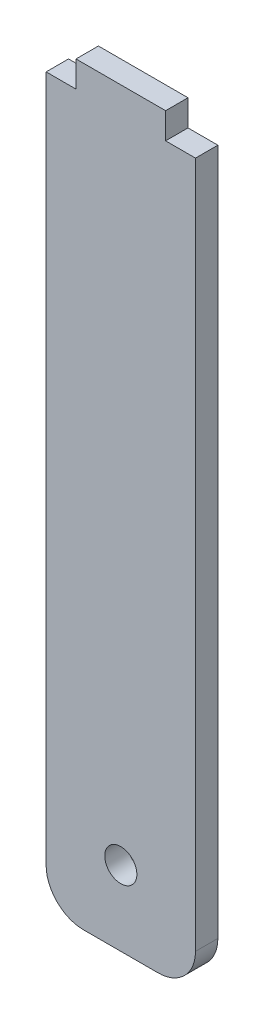
ISO-10303-21;
HEADER;
FILE_DESCRIPTION(('STEP AP214'),'2;1');
FILE_NAME('part.step','',(''),(''),'','','');
FILE_SCHEMA(('AUTOMOTIVE_DESIGN { 1 0 10303 214 1 1 1 1 }'));
ENDSEC;
DATA;
#1=APPLICATION_CONTEXT('core data for automotive mechanical design processes');
#2=APPLICATION_PROTOCOL_DEFINITION('international standard','automotive_design',2000,#1);
#3=PRODUCT_CONTEXT('',#1,'mechanical');
#4=PRODUCT('Part','Part','',(#3));
#5=PRODUCT_RELATED_PRODUCT_CATEGORY('part','',(#4));
#6=PRODUCT_DEFINITION_FORMATION('','',#4);
#7=PRODUCT_DEFINITION_CONTEXT('part definition',#1,'design');
#8=PRODUCT_DEFINITION('design','',#6,#7);
#9=PRODUCT_DEFINITION_SHAPE('','',#8);
#10=(LENGTH_UNIT() NAMED_UNIT(*) SI_UNIT(.MILLI.,.METRE.));
#11=(NAMED_UNIT(*) PLANE_ANGLE_UNIT() SI_UNIT($,.RADIAN.));
#12=(NAMED_UNIT(*) SI_UNIT($,.STERADIAN.) SOLID_ANGLE_UNIT());
#13=UNCERTAINTY_MEASURE_WITH_UNIT(LENGTH_MEASURE(1.E-05),#10,'distance_accuracy_value','');
#14=(GEOMETRIC_REPRESENTATION_CONTEXT(3) GLOBAL_UNCERTAINTY_ASSIGNED_CONTEXT((#13)) GLOBAL_UNIT_ASSIGNED_CONTEXT((#10,
#11,#12)) REPRESENTATION_CONTEXT('',''));
#15=CARTESIAN_POINT('',(0.,0.,0.));
#16=DIRECTION('',(0.,0.,1.));
#17=DIRECTION('',(1.,0.,0.));
#18=AXIS2_PLACEMENT_3D('',#15,#16,#17);
#19=CARTESIAN_POINT('',(0.,0.,3.));
#20=DIRECTION('',(0.,0.,-1.));
#21=DIRECTION('',(-1.,0.,0.));
#22=AXIS2_PLACEMENT_3D('',#19,#20,#21);
#23=PLANE('',#22);
#24=DIRECTION('',(0.,-1.,0.));
#25=VECTOR('',#24,1.);
#26=CARTESIAN_POINT('',(0.,0.,3.));
#27=LINE('',#26,#25);
#28=CARTESIAN_POINT('',(0.,97.,3.));
#29=VERTEX_POINT('',#28);
#30=CARTESIAN_POINT('',(0.,5.,3.));
#31=VERTEX_POINT('',#30);
#32=EDGE_CURVE('E163',#29,#31,#27,.T.);
#33=ORIENTED_EDGE('',*,*,#32,.T.);
#34=CARTESIAN_POINT('',(5.,5.,3.));
#35=DIRECTION('',(0.,0.,-1.));
#36=DIRECTION('',(-1.,0.,0.));
#37=AXIS2_PLACEMENT_3D('',#34,#35,#36);
#38=CIRCLE('',#37,5.);
#39=CARTESIAN_POINT('',(5.,0.,3.));
#40=VERTEX_POINT('',#39);
#41=EDGE_CURVE('E42',#31,#40,#38,.F.);
#42=ORIENTED_EDGE('',*,*,#41,.T.);
#43=DIRECTION('',(1.,0.,0.));
#44=VECTOR('',#43,1.);
#45=CARTESIAN_POINT('',(0.,0.,3.));
#46=LINE('',#45,#44);
#47=CARTESIAN_POINT('',(15.,0.,3.));
#48=VERTEX_POINT('',#47);
#49=EDGE_CURVE('E119',#40,#48,#46,.T.);
#50=ORIENTED_EDGE('',*,*,#49,.T.);
#51=CARTESIAN_POINT('',(15.,5.,3.));
#52=DIRECTION('',(0.,0.,-1.));
#53=DIRECTION('',(-1.,0.,0.));
#54=AXIS2_PLACEMENT_3D('',#51,#52,#53);
#55=CIRCLE('',#54,5.);
#56=CARTESIAN_POINT('',(20.,5.,3.));
#57=VERTEX_POINT('',#56);
#58=EDGE_CURVE('E49',#48,#57,#55,.F.);
#59=ORIENTED_EDGE('',*,*,#58,.T.);
#60=DIRECTION('',(0.,1.,0.));
#61=VECTOR('',#60,1.);
#62=CARTESIAN_POINT('',(20.,0.,3.));
#63=LINE('',#62,#61);
#64=CARTESIAN_POINT('',(20.,97.,3.));
#65=VERTEX_POINT('',#64);
#66=EDGE_CURVE('E111',#57,#65,#63,.T.);
#67=ORIENTED_EDGE('',*,*,#66,.T.);
#68=DIRECTION('',(-1.,0.,0.));
#69=VECTOR('',#68,1.);
#70=CARTESIAN_POINT('',(16.,97.,3.));
#71=LINE('',#70,#69);
#72=CARTESIAN_POINT('',(16.,97.,3.));
#73=VERTEX_POINT('',#72);
#74=EDGE_CURVE('E115',#65,#73,#71,.T.);
#75=ORIENTED_EDGE('',*,*,#74,.T.);
#76=DIRECTION('',(0.,1.,0.));
#77=VECTOR('',#76,1.);
#78=CARTESIAN_POINT('',(16.,97.,3.));
#79=LINE('',#78,#77);
#80=CARTESIAN_POINT('',(16.,100.5,3.));
#81=VERTEX_POINT('',#80);
#82=EDGE_CURVE('E134',#73,#81,#79,.T.);
#83=ORIENTED_EDGE('',*,*,#82,.T.);
#84=DIRECTION('',(-1.,0.,0.));
#85=VECTOR('',#84,1.);
#86=CARTESIAN_POINT('',(3.99999999999999,100.5,3.));
#87=LINE('',#86,#85);
#88=CARTESIAN_POINT('',(3.99999999999999,100.5,3.));
#89=VERTEX_POINT('',#88);
#90=EDGE_CURVE('E136',#81,#89,#87,.T.);
#91=ORIENTED_EDGE('',*,*,#90,.T.);
#92=DIRECTION('',(0.,-1.,0.));
#93=VECTOR('',#92,1.);
#94=CARTESIAN_POINT('',(3.99999999999999,97.,3.));
#95=LINE('',#94,#93);
#96=CARTESIAN_POINT('',(3.99999999999999,97.,3.));
#97=VERTEX_POINT('',#96);
#98=EDGE_CURVE('E141',#89,#97,#95,.T.);
#99=ORIENTED_EDGE('',*,*,#98,.T.);
#100=DIRECTION('',(-1.,0.,0.));
#101=VECTOR('',#100,1.);
#102=CARTESIAN_POINT('',(0.,97.,3.));
#103=LINE('',#102,#101);
#104=EDGE_CURVE('E143',#97,#29,#103,.T.);
#105=ORIENTED_EDGE('',*,*,#104,.T.);
#106=EDGE_LOOP('',(#33,#42,#50,#59,#67,#75,#83,#91,#99,#105));
#107=FACE_BOUND('',#106,.T.);
#108=CARTESIAN_POINT('',(9.99999999999999,10.,3.));
#109=DIRECTION('',(0.,0.,1.));
#110=DIRECTION('',(1.,0.,0.));
#111=AXIS2_PLACEMENT_3D('',#108,#109,#110);
#112=CIRCLE('',#111,2.15);
#113=CARTESIAN_POINT('',(12.15,10.,3.));
#114=VERTEX_POINT('',#113);
#115=EDGE_CURVE('E149',#114,#114,#112,.T.);
#116=ORIENTED_EDGE('',*,*,#115,.F.);
#117=EDGE_LOOP('',(#116));
#118=FACE_BOUND('',#117,.T.);
#119=ADVANCED_FACE('F34',(#107,#118),#23,.F.);
#120=CARTESIAN_POINT('',(0.,0.,0.));
#121=DIRECTION('',(0.,0.,-1.));
#122=DIRECTION('',(-1.,0.,0.));
#123=AXIS2_PLACEMENT_3D('',#120,#121,#122);
#124=PLANE('',#123);
#125=DIRECTION('',(1.,0.,0.));
#126=VECTOR('',#125,1.);
#127=CARTESIAN_POINT('',(0.,0.,0.));
#128=LINE('',#127,#126);
#129=CARTESIAN_POINT('',(5.,0.,0.));
#130=VERTEX_POINT('',#129);
#131=CARTESIAN_POINT('',(15.,0.,0.));
#132=VERTEX_POINT('',#131);
#133=EDGE_CURVE('E148',#130,#132,#128,.T.);
#134=ORIENTED_EDGE('',*,*,#133,.F.);
#135=CARTESIAN_POINT('',(5.,5.,0.));
#136=DIRECTION('',(0.,0.,-1.));
#137=DIRECTION('',(-1.,0.,0.));
#138=AXIS2_PLACEMENT_3D('',#135,#136,#137);
#139=CIRCLE('',#138,5.);
#140=CARTESIAN_POINT('',(0.,5.,0.));
#141=VERTEX_POINT('',#140);
#142=EDGE_CURVE('E182',#130,#141,#139,.T.);
#143=ORIENTED_EDGE('',*,*,#142,.T.);
#144=DIRECTION('',(0.,-1.,0.));
#145=VECTOR('',#144,1.);
#146=CARTESIAN_POINT('',(0.,0.,0.));
#147=LINE('',#146,#145);
#148=CARTESIAN_POINT('',(0.,97.,0.));
#149=VERTEX_POINT('',#148);
#150=EDGE_CURVE('E146',#149,#141,#147,.T.);
#151=ORIENTED_EDGE('',*,*,#150,.F.);
#152=DIRECTION('',(-1.,0.,0.));
#153=VECTOR('',#152,1.);
#154=CARTESIAN_POINT('',(0.,97.,0.));
#155=LINE('',#154,#153);
#156=CARTESIAN_POINT('',(3.99999999999999,97.,0.));
#157=VERTEX_POINT('',#156);
#158=EDGE_CURVE('E161',#157,#149,#155,.T.);
#159=ORIENTED_EDGE('',*,*,#158,.F.);
#160=DIRECTION('',(0.,-1.,0.));
#161=VECTOR('',#160,1.);
#162=CARTESIAN_POINT('',(3.99999999999999,97.,0.));
#163=LINE('',#162,#161);
#164=CARTESIAN_POINT('',(3.99999999999999,100.5,0.));
#165=VERTEX_POINT('',#164);
#166=EDGE_CURVE('E159',#165,#157,#163,.T.);
#167=ORIENTED_EDGE('',*,*,#166,.F.);
#168=DIRECTION('',(-1.,0.,0.));
#169=VECTOR('',#168,1.);
#170=CARTESIAN_POINT('',(3.99999999999999,100.5,0.));
#171=LINE('',#170,#169);
#172=CARTESIAN_POINT('',(16.,100.5,0.));
#173=VERTEX_POINT('',#172);
#174=EDGE_CURVE('E157',#173,#165,#171,.T.);
#175=ORIENTED_EDGE('',*,*,#174,.F.);
#176=DIRECTION('',(0.,1.,0.));
#177=VECTOR('',#176,1.);
#178=CARTESIAN_POINT('',(16.,97.,0.));
#179=LINE('',#178,#177);
#180=CARTESIAN_POINT('',(16.,97.,0.));
#181=VERTEX_POINT('',#180);
#182=EDGE_CURVE('E155',#181,#173,#179,.T.);
#183=ORIENTED_EDGE('',*,*,#182,.F.);
#184=DIRECTION('',(-1.,0.,0.));
#185=VECTOR('',#184,1.);
#186=CARTESIAN_POINT('',(16.,97.,0.));
#187=LINE('',#186,#185);
#188=CARTESIAN_POINT('',(20.,97.,0.));
#189=VERTEX_POINT('',#188);
#190=EDGE_CURVE('E153',#189,#181,#187,.T.);
#191=ORIENTED_EDGE('',*,*,#190,.F.);
#192=DIRECTION('',(0.,1.,0.));
#193=VECTOR('',#192,1.);
#194=CARTESIAN_POINT('',(20.,0.,0.));
#195=LINE('',#194,#193);
#196=CARTESIAN_POINT('',(20.,5.,0.));
#197=VERTEX_POINT('',#196);
#198=EDGE_CURVE('E125',#197,#189,#195,.T.);
#199=ORIENTED_EDGE('',*,*,#198,.F.);
#200=CARTESIAN_POINT('',(15.,5.,0.));
#201=DIRECTION('',(0.,0.,-1.));
#202=DIRECTION('',(-1.,0.,0.));
#203=AXIS2_PLACEMENT_3D('',#200,#201,#202);
#204=CIRCLE('',#203,5.);
#205=EDGE_CURVE('E180',#197,#132,#204,.T.);
#206=ORIENTED_EDGE('',*,*,#205,.T.);
#207=EDGE_LOOP('',(#134,#143,#151,#159,#167,#175,#183,#191,#199,#206));
#208=FACE_BOUND('',#207,.T.);
#209=CARTESIAN_POINT('',(9.99999999999999,10.,0.));
#210=DIRECTION('',(0.,0.,1.));
#211=DIRECTION('',(1.,0.,0.));
#212=AXIS2_PLACEMENT_3D('',#209,#210,#211);
#213=CIRCLE('',#212,2.15);
#214=CARTESIAN_POINT('',(12.15,10.,0.));
#215=VERTEX_POINT('',#214);
#216=EDGE_CURVE('E328',#215,#215,#213,.T.);
#217=ORIENTED_EDGE('',*,*,#216,.T.);
#218=EDGE_LOOP('',(#217));
#219=FACE_BOUND('',#218,.T.);
#220=ADVANCED_FACE('F196',(#208,#219),#124,.T.);
#221=CARTESIAN_POINT('',(0.,0.,3.));
#222=DIRECTION('',(1.,0.,0.));
#223=DIRECTION('',(0.,0.,-1.));
#224=AXIS2_PLACEMENT_3D('',#221,#222,#223);
#225=PLANE('',#224);
#226=ORIENTED_EDGE('',*,*,#150,.T.);
#227=DIRECTION('',(0.,0.,-1.));
#228=VECTOR('',#227,1.);
#229=CARTESIAN_POINT('',(0.,5.,3.));
#230=LINE('',#229,#228);
#231=EDGE_CURVE('E57',#141,#31,#230,.F.);
#232=ORIENTED_EDGE('',*,*,#231,.T.);
#233=ORIENTED_EDGE('',*,*,#32,.F.);
#234=DIRECTION('',(0.,0.,-1.));
#235=VECTOR('',#234,1.);
#236=CARTESIAN_POINT('',(0.,97.,3.));
#237=LINE('',#236,#235);
#238=EDGE_CURVE('E145',#29,#149,#237,.T.);
#239=ORIENTED_EDGE('',*,*,#238,.T.);
#240=EDGE_LOOP('',(#226,#232,#233,#239));
#241=FACE_BOUND('',#240,.T.);
#242=ADVANCED_FACE('F199',(#241),#225,.F.);
#243=CARTESIAN_POINT('',(0.,0.,3.));
#244=DIRECTION('',(0.,1.,0.));
#245=DIRECTION('',(0.,0.,1.));
#246=AXIS2_PLACEMENT_3D('',#243,#244,#245);
#247=PLANE('',#246);
#248=ORIENTED_EDGE('',*,*,#49,.F.);
#249=DIRECTION('',(0.,0.,-1.));
#250=VECTOR('',#249,1.);
#251=CARTESIAN_POINT('',(5.,0.,3.));
#252=LINE('',#251,#250);
#253=EDGE_CURVE('E177',#40,#130,#252,.T.);
#254=ORIENTED_EDGE('',*,*,#253,.T.);
#255=ORIENTED_EDGE('',*,*,#133,.T.);
#256=DIRECTION('',(0.,0.,-1.));
#257=VECTOR('',#256,1.);
#258=CARTESIAN_POINT('',(15.,0.,3.));
#259=LINE('',#258,#257);
#260=EDGE_CURVE('E128',#132,#48,#259,.F.);
#261=ORIENTED_EDGE('',*,*,#260,.T.);
#262=EDGE_LOOP('',(#248,#254,#255,#261));
#263=FACE_BOUND('',#262,.T.);
#264=ADVANCED_FACE('F190',(#263),#247,.F.);
#265=CARTESIAN_POINT('',(20.,0.,3.));
#266=DIRECTION('',(-1.,0.,0.));
#267=DIRECTION('',(0.,0.,1.));
#268=AXIS2_PLACEMENT_3D('',#265,#266,#267);
#269=PLANE('',#268);
#270=ORIENTED_EDGE('',*,*,#66,.F.);
#271=DIRECTION('',(0.,0.,-1.));
#272=VECTOR('',#271,1.);
#273=CARTESIAN_POINT('',(20.,5.,3.));
#274=LINE('',#273,#272);
#275=EDGE_CURVE('E11',#57,#197,#274,.T.);
#276=ORIENTED_EDGE('',*,*,#275,.T.);
#277=ORIENTED_EDGE('',*,*,#198,.T.);
#278=DIRECTION('',(0.,0.,-1.));
#279=VECTOR('',#278,1.);
#280=CARTESIAN_POINT('',(20.,97.,3.));
#281=LINE('',#280,#279);
#282=EDGE_CURVE('E122',#65,#189,#281,.T.);
#283=ORIENTED_EDGE('',*,*,#282,.F.);
#284=EDGE_LOOP('',(#270,#276,#277,#283));
#285=FACE_BOUND('',#284,.T.);
#286=ADVANCED_FACE('F123',(#285),#269,.F.);
#287=CARTESIAN_POINT('',(16.,97.,3.));
#288=DIRECTION('',(0.,-1.,0.));
#289=DIRECTION('',(0.,0.,-1.));
#290=AXIS2_PLACEMENT_3D('',#287,#288,#289);
#291=PLANE('',#290);
#292=ORIENTED_EDGE('',*,*,#190,.T.);
#293=DIRECTION('',(0.,0.,-1.));
#294=VECTOR('',#293,1.);
#295=CARTESIAN_POINT('',(16.,97.,3.));
#296=LINE('',#295,#294);
#297=EDGE_CURVE('E129',#73,#181,#296,.T.);
#298=ORIENTED_EDGE('',*,*,#297,.F.);
#299=ORIENTED_EDGE('',*,*,#74,.F.);
#300=ORIENTED_EDGE('',*,*,#282,.T.);
#301=EDGE_LOOP('',(#292,#298,#299,#300));
#302=FACE_BOUND('',#301,.T.);
#303=ADVANCED_FACE('F131',(#302),#291,.F.);
#304=CARTESIAN_POINT('',(16.,97.,3.));
#305=DIRECTION('',(-1.,0.,0.));
#306=DIRECTION('',(0.,0.,1.));
#307=AXIS2_PLACEMENT_3D('',#304,#305,#306);
#308=PLANE('',#307);
#309=ORIENTED_EDGE('',*,*,#182,.T.);
#310=DIRECTION('',(0.,0.,-1.));
#311=VECTOR('',#310,1.);
#312=CARTESIAN_POINT('',(16.,100.5,3.));
#313=LINE('',#312,#311);
#314=EDGE_CURVE('E172',#81,#173,#313,.T.);
#315=ORIENTED_EDGE('',*,*,#314,.F.);
#316=ORIENTED_EDGE('',*,*,#82,.F.);
#317=ORIENTED_EDGE('',*,*,#297,.T.);
#318=EDGE_LOOP('',(#309,#315,#316,#317));
#319=FACE_BOUND('',#318,.T.);
#320=ADVANCED_FACE('F217',(#319),#308,.F.);
#321=CARTESIAN_POINT('',(3.99999999999999,100.5,3.));
#322=DIRECTION('',(0.,-1.,0.));
#323=DIRECTION('',(0.,0.,-1.));
#324=AXIS2_PLACEMENT_3D('',#321,#322,#323);
#325=PLANE('',#324);
#326=ORIENTED_EDGE('',*,*,#174,.T.);
#327=DIRECTION('',(0.,0.,-1.));
#328=VECTOR('',#327,1.);
#329=CARTESIAN_POINT('',(3.99999999999999,100.5,3.));
#330=LINE('',#329,#328);
#331=EDGE_CURVE('E169',#89,#165,#330,.T.);
#332=ORIENTED_EDGE('',*,*,#331,.F.);
#333=ORIENTED_EDGE('',*,*,#90,.F.);
#334=ORIENTED_EDGE('',*,*,#314,.T.);
#335=EDGE_LOOP('',(#326,#332,#333,#334));
#336=FACE_BOUND('',#335,.T.);
#337=ADVANCED_FACE('F214',(#336),#325,.F.);
#338=CARTESIAN_POINT('',(3.99999999999999,97.,3.));
#339=DIRECTION('',(1.,0.,0.));
#340=DIRECTION('',(0.,0.,-1.));
#341=AXIS2_PLACEMENT_3D('',#338,#339,#340);
#342=PLANE('',#341);
#343=ORIENTED_EDGE('',*,*,#166,.T.);
#344=DIRECTION('',(0.,0.,-1.));
#345=VECTOR('',#344,1.);
#346=CARTESIAN_POINT('',(3.99999999999999,97.,3.));
#347=LINE('',#346,#345);
#348=EDGE_CURVE('E166',#97,#157,#347,.T.);
#349=ORIENTED_EDGE('',*,*,#348,.F.);
#350=ORIENTED_EDGE('',*,*,#98,.F.);
#351=ORIENTED_EDGE('',*,*,#331,.T.);
#352=EDGE_LOOP('',(#343,#349,#350,#351));
#353=FACE_BOUND('',#352,.T.);
#354=ADVANCED_FACE('F209',(#353),#342,.F.);
#355=CARTESIAN_POINT('',(0.,97.,3.));
#356=DIRECTION('',(0.,-1.,0.));
#357=DIRECTION('',(0.,0.,-1.));
#358=AXIS2_PLACEMENT_3D('',#355,#356,#357);
#359=PLANE('',#358);
#360=ORIENTED_EDGE('',*,*,#158,.T.);
#361=ORIENTED_EDGE('',*,*,#238,.F.);
#362=ORIENTED_EDGE('',*,*,#104,.F.);
#363=ORIENTED_EDGE('',*,*,#348,.T.);
#364=EDGE_LOOP('',(#360,#361,#362,#363));
#365=FACE_BOUND('',#364,.T.);
#366=ADVANCED_FACE('F203',(#365),#359,.F.);
#367=CARTESIAN_POINT('',(9.99999999999999,10.,3.));
#368=DIRECTION('',(0.,0.,-1.));
#369=DIRECTION('',(-1.,0.,0.));
#370=AXIS2_PLACEMENT_3D('',#367,#368,#369);
#371=CYLINDRICAL_SURFACE('',#370,2.15);
#372=ORIENTED_EDGE('',*,*,#115,.T.);
#373=EDGE_LOOP('',(#372));
#374=FACE_BOUND('',#373,.T.);
#375=ORIENTED_EDGE('',*,*,#216,.F.);
#376=EDGE_LOOP('',(#375));
#377=FACE_BOUND('',#376,.T.);
#378=ADVANCED_FACE('F223',(#374,#377),#371,.F.);
#379=CARTESIAN_POINT('',(5.,5.,3.));
#380=DIRECTION('',(0.,0.,-1.));
#381=DIRECTION('',(-1.,0.,0.));
#382=AXIS2_PLACEMENT_3D('',#379,#380,#381);
#383=CYLINDRICAL_SURFACE('',#382,5.);
#384=ORIENTED_EDGE('',*,*,#41,.F.);
#385=ORIENTED_EDGE('',*,*,#231,.F.);
#386=ORIENTED_EDGE('',*,*,#142,.F.);
#387=ORIENTED_EDGE('',*,*,#253,.F.);
#388=EDGE_LOOP('',(#384,#385,#386,#387));
#389=FACE_BOUND('',#388,.T.);
#390=ADVANCED_FACE('F193',(#389),#383,.T.);
#391=CARTESIAN_POINT('',(15.,5.,3.));
#392=DIRECTION('',(0.,0.,-1.));
#393=DIRECTION('',(-1.,0.,0.));
#394=AXIS2_PLACEMENT_3D('',#391,#392,#393);
#395=CYLINDRICAL_SURFACE('',#394,5.);
#396=ORIENTED_EDGE('',*,*,#58,.F.);
#397=ORIENTED_EDGE('',*,*,#260,.F.);
#398=ORIENTED_EDGE('',*,*,#205,.F.);
#399=ORIENTED_EDGE('',*,*,#275,.F.);
#400=EDGE_LOOP('',(#396,#397,#398,#399));
#401=FACE_BOUND('',#400,.T.);
#402=ADVANCED_FACE('F36',(#401),#395,.T.);
#403=CLOSED_SHELL('',(#119,#220,#242,#264,#286,#303,#320,#337,#354,#366,#378,#390,#402));
#404=MANIFOLD_SOLID_BREP('B2',#403);
#405=ADVANCED_BREP_SHAPE_REPRESENTATION('',(#18,#404),#14);
#406=SHAPE_DEFINITION_REPRESENTATION(#9,#405);
ENDSEC;
END-ISO-10303-21;
